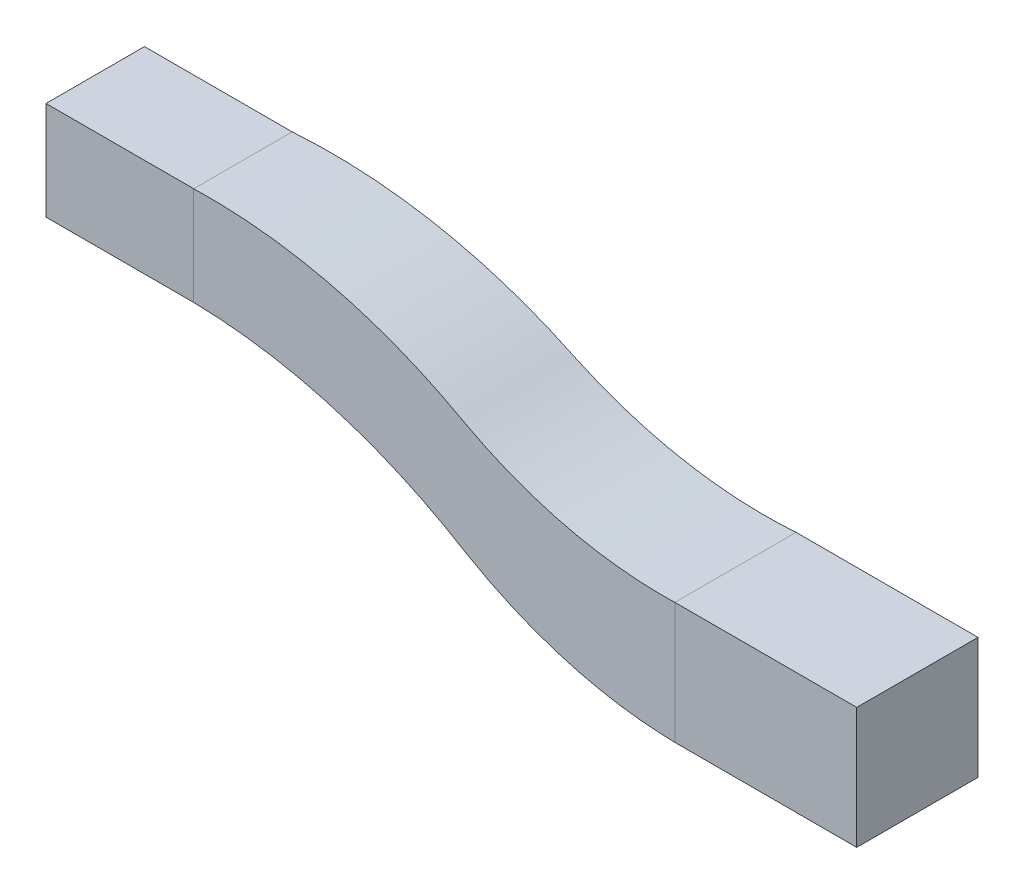
ISO-10303-21;
HEADER;
FILE_DESCRIPTION(('STEP AP214'),'2;1');
FILE_NAME('part.step','',(''),(''),'','','');
FILE_SCHEMA(('AUTOMOTIVE_DESIGN { 1 0 10303 214 1 1 1 1 }'));
ENDSEC;
DATA;
#1=APPLICATION_CONTEXT('core data for automotive mechanical design processes');
#2=APPLICATION_PROTOCOL_DEFINITION('international standard','automotive_design',2000,#1);
#3=PRODUCT_CONTEXT('',#1,'mechanical');
#4=PRODUCT('Part','Part','',(#3));
#5=PRODUCT_RELATED_PRODUCT_CATEGORY('part','',(#4));
#6=PRODUCT_DEFINITION_FORMATION('','',#4);
#7=PRODUCT_DEFINITION_CONTEXT('part definition',#1,'design');
#8=PRODUCT_DEFINITION('design','',#6,#7);
#9=PRODUCT_DEFINITION_SHAPE('','',#8);
#10=(LENGTH_UNIT() NAMED_UNIT(*) SI_UNIT(.MILLI.,.METRE.));
#11=(NAMED_UNIT(*) PLANE_ANGLE_UNIT() SI_UNIT($,.RADIAN.));
#12=(NAMED_UNIT(*) SI_UNIT($,.STERADIAN.) SOLID_ANGLE_UNIT());
#13=UNCERTAINTY_MEASURE_WITH_UNIT(LENGTH_MEASURE(1.E-05),#10,'distance_accuracy_value','');
#14=(GEOMETRIC_REPRESENTATION_CONTEXT(3) GLOBAL_UNCERTAINTY_ASSIGNED_CONTEXT((#13)) GLOBAL_UNIT_ASSIGNED_CONTEXT((#10,
#11,#12)) REPRESENTATION_CONTEXT('',''));
#15=CARTESIAN_POINT('',(0.,0.,0.));
#16=DIRECTION('',(0.,0.,1.));
#17=DIRECTION('',(1.,0.,0.));
#18=AXIS2_PLACEMENT_3D('',#15,#16,#17);
#19=CARTESIAN_POINT('',(0.,102.108,-102.108));
#20=CARTESIAN_POINT('',(196.914895518404,111.826893239597,-106.48938014345));
#21=CARTESIAN_POINT('',(392.936444227266,69.5371543284615,-110.870760286901));
#22=CARTESIAN_POINT('',(708.143629326014,-92.2794355974837,-118.744760286901));
#23=CARTESIAN_POINT('',(864.402326566791,-125.99072679191,-122.23738014345));
#24=CARTESIAN_POINT('',(1021.37315576226,-118.243305111773,-125.73));
#25=CARTESIAN_POINT('',(0.,102.108,-93.599));
#26=CARTESIAN_POINT('',(196.914895518404,111.826893239597,-97.6152651314962));
#27=CARTESIAN_POINT('',(392.936444227266,69.5371543284615,-101.631530262992));
#28=CARTESIAN_POINT('',(708.143629326014,-92.2794355974837,-108.849363596326));
#29=CARTESIAN_POINT('',(864.402326566791,-125.99072679191,-112.050931798163));
#30=CARTESIAN_POINT('',(1021.37315576226,-118.243305111773,-115.2525));
#31=CARTESIAN_POINT('',(0.,102.108,-76.581));
#32=CARTESIAN_POINT('',(196.914895518404,111.826893239597,-79.8670351075878));
#33=CARTESIAN_POINT('',(392.936444227267,69.5371543284615,-83.1530702151756));
#34=CARTESIAN_POINT('',(708.143629326014,-92.2794355974837,-89.0585702151756));
#35=CARTESIAN_POINT('',(864.402326566792,-125.99072679191,-91.6780351075878));
#36=CARTESIAN_POINT('',(1021.37315576226,-118.243305111773,-94.2975));
#37=CARTESIAN_POINT('',(0.,102.108,-51.054));
#38=CARTESIAN_POINT('',(196.914895518404,111.826893239597,-53.2446900717252));
#39=CARTESIAN_POINT('',(392.936444227266,69.5371543284615,-55.4353801434504));
#40=CARTESIAN_POINT('',(708.143629326014,-92.2794355974837,-59.3723801434504));
#41=CARTESIAN_POINT('',(864.402326566791,-125.99072679191,-61.1186900717252));
#42=CARTESIAN_POINT('',(1021.37315576226,-118.243305111773,-62.865));
#43=CARTESIAN_POINT('',(0.,102.108,-25.527));
#44=CARTESIAN_POINT('',(196.914895518404,111.826893239597,-26.6223450358626));
#45=CARTESIAN_POINT('',(392.936444227266,69.5371543284615,-27.7176900717252));
#46=CARTESIAN_POINT('',(708.143629326014,-92.2794355974838,-29.6861900717253));
#47=CARTESIAN_POINT('',(864.402326566791,-125.99072679191,-30.5593450358627));
#48=CARTESIAN_POINT('',(1021.37315576226,-118.243305111773,-31.4325000000001));
#49=CARTESIAN_POINT('',(0.,102.108,-8.509));
#50=CARTESIAN_POINT('',(196.914895518404,111.826893239597,-8.8741150119542));
#51=CARTESIAN_POINT('',(392.936444227266,69.5371543284615,-9.2392300239084));
#52=CARTESIAN_POINT('',(708.143629326014,-92.2794355974838,-9.89539669057507));
#53=CARTESIAN_POINT('',(864.402326566791,-125.99072679191,-10.1864483452875));
#54=CARTESIAN_POINT('',(1021.37315576226,-118.243305111773,-10.4775));
#55=CARTESIAN_POINT('',(0.,102.108,8.509));
#56=CARTESIAN_POINT('',(196.914895518404,111.826893239597,8.8741150119542));
#57=CARTESIAN_POINT('',(392.936444227266,69.5371543284615,9.2392300239084));
#58=CARTESIAN_POINT('',(708.143629326014,-92.2794355974838,9.89539669057507));
#59=CARTESIAN_POINT('',(864.402326566791,-125.99072679191,10.1864483452875));
#60=CARTESIAN_POINT('',(1021.37315576226,-118.243305111773,10.4775));
#61=CARTESIAN_POINT('',(0.,102.108,25.527));
#62=CARTESIAN_POINT('',(196.914895518404,111.826893239597,26.6223450358626));
#63=CARTESIAN_POINT('',(392.936444227266,69.5371543284614,27.7176900717252));
#64=CARTESIAN_POINT('',(708.143629326013,-92.2794355974838,29.6861900717252));
#65=CARTESIAN_POINT('',(864.40232656679,-125.99072679191,30.5593450358626));
#66=CARTESIAN_POINT('',(1021.37315576226,-118.243305111773,31.4325));
#67=CARTESIAN_POINT('',(0.,102.108,51.054));
#68=CARTESIAN_POINT('',(196.914895518404,111.826893239597,53.2446900717252));
#69=CARTESIAN_POINT('',(392.936444227267,69.5371543284615,55.4353801434504));
#70=CARTESIAN_POINT('',(708.143629326015,-92.2794355974837,59.3723801434504));
#71=CARTESIAN_POINT('',(864.402326566792,-125.99072679191,61.1186900717252));
#72=CARTESIAN_POINT('',(1021.37315576226,-118.243305111773,62.865));
#73=CARTESIAN_POINT('',(0.,102.108,76.5809999999999));
#74=CARTESIAN_POINT('',(196.914895518404,111.826893239597,79.8670351075878));
#75=CARTESIAN_POINT('',(392.936444227266,69.5371543284614,83.1530702151756));
#76=CARTESIAN_POINT('',(708.143629326013,-92.2794355974838,89.0585702151756));
#77=CARTESIAN_POINT('',(864.40232656679,-125.99072679191,91.6780351075878));
#78=CARTESIAN_POINT('',(1021.37315576226,-118.243305111773,94.2975));
#79=CARTESIAN_POINT('',(0.,102.108,93.5989999999999));
#80=CARTESIAN_POINT('',(196.914895518404,111.826893239597,97.6152651314962));
#81=CARTESIAN_POINT('',(392.936444227266,69.5371543284614,101.631530262992));
#82=CARTESIAN_POINT('',(708.143629326014,-92.2794355974838,108.849363596326));
#83=CARTESIAN_POINT('',(864.402326566791,-125.99072679191,112.050931798163));
#84=CARTESIAN_POINT('',(1021.37315576226,-118.243305111773,115.2525));
#85=CARTESIAN_POINT('',(0.,102.108,102.108));
#86=CARTESIAN_POINT('',(196.914895518404,111.826893239597,106.48938014345));
#87=CARTESIAN_POINT('',(392.936444227266,69.5371543284614,110.870760286901));
#88=CARTESIAN_POINT('',(708.143629326014,-92.2794355974838,118.744760286901));
#89=CARTESIAN_POINT('',(864.402326566791,-125.99072679191,122.23738014345));
#90=CARTESIAN_POINT('',(1021.37315576226,-118.243305111773,125.73));
#91=B_SPLINE_SURFACE_WITH_KNOTS('',3,3,((#19,#20,#21,#22,#23,#24),(#25,#26,#27,#28,#29,#30),
(#31,#32,#33,#34,#35,#36),(#37,#38,#39,#40,#41,#42),(#43,#44,#45,#46,#47,#48),(#49,#50,#51,#52,
#53,#54),(#55,#56,#57,#58,#59,#60),(#61,#62,#63,#64,#65,#66),(#67,#68,#69,#70,#71,#72),(#73,#74,
#75,#76,#77,#78),(#79,#80,#81,#82,#83,#84),(#85,#86,#87,#88,#89,#90)),.UNSPECIFIED.,.F.,.F.,.F.,
(4,1,1,1,2,1,1,1,4),(4,2,4),(0.75,0.78125,0.8125,0.84375,0.875,0.90625,0.9375,0.96875,1.),(0.,
0.556436391090984,1.),.UNSPECIFIED.);
#92=DIRECTION('',(0.,0.,1.));
#93=VECTOR('',#92,1.);
#94=CARTESIAN_POINT('',(0.,102.108,-102.108));
#95=LINE('',#94,#93);
#96=CARTESIAN_POINT('',(0.,102.108,-102.108));
#97=VERTEX_POINT('',#96);
#98=CARTESIAN_POINT('',(0.,102.108,102.108));
#99=VERTEX_POINT('',#98);
#100=EDGE_CURVE('E329',#97,#99,#95,.T.);
#101=CARTESIAN_POINT('',(0.,102.108,102.108));
#102=CARTESIAN_POINT('',(196.914895518404,111.826893239597,106.48938014345));
#103=CARTESIAN_POINT('',(392.936444227266,69.5371543284614,110.870760286901));
#104=CARTESIAN_POINT('',(708.143629326014,-92.2794355974838,118.744760286901));
#105=CARTESIAN_POINT('',(864.402326566791,-125.99072679191,122.23738014345));
#106=CARTESIAN_POINT('',(1021.37315576226,-118.243305111773,125.73));
#107=B_SPLINE_CURVE_WITH_KNOTS('',3,(#101,#102,#103,#104,#105,#106),.UNSPECIFIED.,.F.,.F.,(4,2,
4),(0.,0.556436391090984,1.),.UNSPECIFIED.);
#108=CARTESIAN_POINT('',(1021.37315576226,-118.243305111773,125.73));
#109=VERTEX_POINT('',#108);
#110=EDGE_CURVE('E332',#99,#109,#107,.T.);
#111=DIRECTION('',(0.,0.,1.));
#112=VECTOR('',#111,1.);
#113=CARTESIAN_POINT('',(1021.37315576226,-118.243305111773,-125.73));
#114=LINE('',#113,#112);
#115=CARTESIAN_POINT('',(1021.37315576226,-118.243305111773,-125.73));
#116=VERTEX_POINT('',#115);
#117=EDGE_CURVE('E13',#116,#109,#114,.T.);
#118=CARTESIAN_POINT('',(0.,102.108,-102.108));
#119=CARTESIAN_POINT('',(196.914895518404,111.826893239597,-106.48938014345));
#120=CARTESIAN_POINT('',(392.936444227266,69.5371543284615,-110.870760286901));
#121=CARTESIAN_POINT('',(708.143629326014,-92.2794355974837,-118.744760286901));
#122=CARTESIAN_POINT('',(864.402326566791,-125.99072679191,-122.23738014345));
#123=CARTESIAN_POINT('',(1021.37315576226,-118.243305111773,-125.73));
#124=B_SPLINE_CURVE_WITH_KNOTS('',3,(#118,#119,#120,#121,#122,#123),.UNSPECIFIED.,.F.,.F.,(4,2,
4),(0.,0.556436391090984,1.),.UNSPECIFIED.);
#125=EDGE_CURVE('E135',#97,#116,#124,.T.);
#126=ORIENTED_EDGE('',*,*,#100,.T.);
#127=ORIENTED_EDGE('',*,*,#110,.T.);
#128=ORIENTED_EDGE('',*,*,#117,.F.);
#129=ORIENTED_EDGE('',*,*,#125,.F.);
#130=EDGE_LOOP('',(#126,#127,#128,#129));
#131=FACE_BOUND('',#130,.T.);
#132=ADVANCED_FACE('F115',(#131),#91,.T.);
#133=CARTESIAN_POINT('',(0.,-102.108,-102.108));
#134=CARTESIAN_POINT('',(196.914895518404,-101.151867047304,-106.48938014345));
#135=CARTESIAN_POINT('',(392.936444227266,-152.20436624534,-110.870760286901));
#136=CARTESIAN_POINT('',(708.143629326014,-329.768956171285,-118.744760286901));
#137=CARTESIAN_POINT('',(864.402326566791,-370.465487078811,-122.23738014345));
#138=CARTESIAN_POINT('',(1021.37315576226,-369.703305111773,-125.73));
#139=CARTESIAN_POINT('',(0.,-85.0899999999999,-102.108));
#140=CARTESIAN_POINT('',(196.914895518404,-83.4036370233955,-106.48938014345));
#141=CARTESIAN_POINT('',(392.936444227266,-133.725906197523,-110.870760286901));
#142=CARTESIAN_POINT('',(708.143629326014,-309.978162790135,-118.744760286901));
#143=CARTESIAN_POINT('',(864.402326566791,-350.092590388236,-122.23738014345));
#144=CARTESIAN_POINT('',(1021.37315576226,-348.748305111773,-125.73));
#145=CARTESIAN_POINT('',(0.,-51.054,-102.108));
#146=CARTESIAN_POINT('',(196.914895518404,-47.9071769755787,-106.48938014345));
#147=CARTESIAN_POINT('',(392.936444227267,-96.7689861018899,-110.870760286901));
#148=CARTESIAN_POINT('',(708.143629326014,-270.396576027835,-118.744760286901));
#149=CARTESIAN_POINT('',(864.402326566792,-309.346797007086,-122.237380143451));
#150=CARTESIAN_POINT('',(1021.37315576226,-306.838305111773,-125.73));
#151=CARTESIAN_POINT('',(0.,0.,-102.108));
#152=CARTESIAN_POINT('',(196.914895518404,5.33751309614664,-106.48938014345));
#153=CARTESIAN_POINT('',(392.936444227266,-41.3336059584392,-110.870760286901));
#154=CARTESIAN_POINT('',(708.143629326014,-211.024195884384,-118.744760286901));
#155=CARTESIAN_POINT('',(864.402326566791,-248.22810693536,-122.23738014345));
#156=CARTESIAN_POINT('',(1021.37315576226,-243.973305111772,-125.73));
#157=CARTESIAN_POINT('',(0.,51.0540000000001,-102.108));
#158=CARTESIAN_POINT('',(196.914895518404,58.5822031678718,-106.48938014345));
#159=CARTESIAN_POINT('',(392.936444227266,14.101774185011,-110.870760286901));
#160=CARTESIAN_POINT('',(708.143629326013,-151.651815740934,-118.744760286901));
#161=CARTESIAN_POINT('',(864.402326566791,-187.109416863635,-122.237380143451));
#162=CARTESIAN_POINT('',(1021.37315576226,-181.108305111773,-125.73));
#163=CARTESIAN_POINT('',(0.,85.0900000000001,-102.108));
#164=CARTESIAN_POINT('',(196.914895518404,94.0786632156886,-106.48938014345));
#165=CARTESIAN_POINT('',(392.936444227266,51.0586942806447,-110.870760286901));
#166=CARTESIAN_POINT('',(708.143629326014,-112.070228978634,-118.744760286901));
#167=CARTESIAN_POINT('',(864.402326566791,-146.363623482485,-122.23738014345));
#168=CARTESIAN_POINT('',(1021.37315576226,-139.198305111773,-125.73));
#169=CARTESIAN_POINT('',(0.,102.108,-102.108));
#170=CARTESIAN_POINT('',(196.914895518404,111.826893239597,-106.48938014345));
#171=CARTESIAN_POINT('',(392.936444227266,69.5371543284615,-110.870760286901));
#172=CARTESIAN_POINT('',(708.143629326014,-92.2794355974837,-118.744760286901));
#173=CARTESIAN_POINT('',(864.402326566791,-125.99072679191,-122.23738014345));
#174=CARTESIAN_POINT('',(1021.37315576226,-118.243305111773,-125.73));
#175=B_SPLINE_SURFACE_WITH_KNOTS('',3,3,((#133,#134,#135,#136,#137,#138),(#139,#140,#141,#142,
#143,#144),(#145,#146,#147,#148,#149,#150),(#151,#152,#153,#154,#155,#156),(#157,#158,#159,#160,
#161,#162),(#163,#164,#165,#166,#167,#168),(#169,#170,#171,#172,#173,#174)),.UNSPECIFIED.,.F.,
.F.,.F.,(4,1,1,1,4),(4,2,4),(0.5,0.5625,0.625,0.6875,0.75),(0.,0.556436391090984,1.),.UNSPECIFIED.);
#176=DIRECTION('',(0.,1.,0.));
#177=VECTOR('',#176,1.);
#178=CARTESIAN_POINT('',(0.,102.108,-102.108));
#179=LINE('',#178,#177);
#180=CARTESIAN_POINT('',(0.,-102.108,-102.108));
#181=VERTEX_POINT('',#180);
#182=EDGE_CURVE('E274',#181,#97,#179,.T.);
#183=DIRECTION('',(0.,1.,0.));
#184=VECTOR('',#183,1.);
#185=CARTESIAN_POINT('',(1021.37315576226,-118.243305111773,-125.73));
#186=LINE('',#185,#184);
#187=CARTESIAN_POINT('',(1021.37315576226,-369.703305111773,-125.73));
#188=VERTEX_POINT('',#187);
#189=EDGE_CURVE('E127',#188,#116,#186,.T.);
#190=CARTESIAN_POINT('',(0.,-102.108,-102.108));
#191=CARTESIAN_POINT('',(196.914895518404,-101.151867047304,-106.48938014345));
#192=CARTESIAN_POINT('',(392.936444227266,-152.20436624534,-110.870760286901));
#193=CARTESIAN_POINT('',(708.143629326014,-329.768956171285,-118.744760286901));
#194=CARTESIAN_POINT('',(864.402326566791,-370.465487078811,-122.23738014345));
#195=CARTESIAN_POINT('',(1021.37315576226,-369.703305111773,-125.73));
#196=B_SPLINE_CURVE_WITH_KNOTS('',3,(#190,#191,#192,#193,#194,#195),.UNSPECIFIED.,.F.,.F.,(4,2,
4),(0.,0.556436391090984,1.),.UNSPECIFIED.);
#197=EDGE_CURVE('E350',#181,#188,#196,.T.);
#198=ORIENTED_EDGE('',*,*,#182,.T.);
#199=ORIENTED_EDGE('',*,*,#125,.T.);
#200=ORIENTED_EDGE('',*,*,#189,.F.);
#201=ORIENTED_EDGE('',*,*,#197,.F.);
#202=EDGE_LOOP('',(#198,#199,#200,#201));
#203=FACE_BOUND('',#202,.T.);
#204=ADVANCED_FACE('F320',(#203),#175,.T.);
#205=CARTESIAN_POINT('',(0.,-102.108,102.108));
#206=CARTESIAN_POINT('',(196.914895518404,-101.151867047304,106.48938014345));
#207=CARTESIAN_POINT('',(392.936444227266,-152.20436624534,110.870760286901));
#208=CARTESIAN_POINT('',(708.143629326014,-329.768956171285,118.744760286901));
#209=CARTESIAN_POINT('',(864.402326566791,-370.465487078811,122.23738014345));
#210=CARTESIAN_POINT('',(1021.37315576226,-369.703305111773,125.73));
#211=CARTESIAN_POINT('',(0.,-102.108,85.0899999999998));
#212=CARTESIAN_POINT('',(196.914895518404,-101.151867047304,88.7411501195419));
#213=CARTESIAN_POINT('',(392.936444227266,-152.20436624534,92.3923002390839));
#214=CARTESIAN_POINT('',(708.143629326014,-329.768956171285,98.9539669057506));
#215=CARTESIAN_POINT('',(864.402326566791,-370.465487078811,101.864483452875));
#216=CARTESIAN_POINT('',(1021.37315576226,-369.703305111773,104.775));
#217=CARTESIAN_POINT('',(0.,-102.108,51.0539999999999));
#218=CARTESIAN_POINT('',(196.914895518404,-101.151867047304,53.2446900717251));
#219=CARTESIAN_POINT('',(392.936444227267,-152.20436624534,55.4353801434503));
#220=CARTESIAN_POINT('',(708.143629326014,-329.768956171286,59.3723801434504));
#221=CARTESIAN_POINT('',(864.402326566792,-370.465487078811,61.1186900717252));
#222=CARTESIAN_POINT('',(1021.37315576226,-369.703305111773,62.865));
#223=CARTESIAN_POINT('',(0.,-102.108,0.));
#224=CARTESIAN_POINT('',(196.914895518404,-101.151867047304,0.));
#225=CARTESIAN_POINT('',(392.936444227266,-152.20436624534,0.));
#226=CARTESIAN_POINT('',(708.143629326014,-329.768956171285,0.));
#227=CARTESIAN_POINT('',(864.402326566791,-370.46548707881,0.));
#228=CARTESIAN_POINT('',(1021.37315576226,-369.703305111772,0.));
#229=CARTESIAN_POINT('',(0.,-102.108,-51.0540000000001));
#230=CARTESIAN_POINT('',(196.914895518404,-101.151867047304,-53.2446900717253));
#231=CARTESIAN_POINT('',(392.936444227266,-152.20436624534,-55.4353801434505));
#232=CARTESIAN_POINT('',(708.143629326013,-329.768956171286,-59.3723801434505));
#233=CARTESIAN_POINT('',(864.402326566791,-370.465487078811,-61.1186900717253));
#234=CARTESIAN_POINT('',(1021.37315576226,-369.703305111773,-62.8650000000001));
#235=CARTESIAN_POINT('',(0.,-102.108,-85.09));
#236=CARTESIAN_POINT('',(196.914895518404,-101.151867047304,-88.7411501195421));
#237=CARTESIAN_POINT('',(392.936444227266,-152.20436624534,-92.3923002390841));
#238=CARTESIAN_POINT('',(708.143629326014,-329.768956171285,-98.9539669057508));
#239=CARTESIAN_POINT('',(864.402326566791,-370.465487078811,-101.864483452875));
#240=CARTESIAN_POINT('',(1021.37315576226,-369.703305111773,-104.775));
#241=CARTESIAN_POINT('',(0.,-102.108,-102.108));
#242=CARTESIAN_POINT('',(196.914895518404,-101.151867047304,-106.48938014345));
#243=CARTESIAN_POINT('',(392.936444227266,-152.20436624534,-110.870760286901));
#244=CARTESIAN_POINT('',(708.143629326014,-329.768956171285,-118.744760286901));
#245=CARTESIAN_POINT('',(864.402326566791,-370.465487078811,-122.23738014345));
#246=CARTESIAN_POINT('',(1021.37315576226,-369.703305111773,-125.73));
#247=B_SPLINE_SURFACE_WITH_KNOTS('',3,3,((#205,#206,#207,#208,#209,#210),(#211,#212,#213,#214,
#215,#216),(#217,#218,#219,#220,#221,#222),(#223,#224,#225,#226,#227,#228),(#229,#230,#231,#232,
#233,#234),(#235,#236,#237,#238,#239,#240),(#241,#242,#243,#244,#245,#246)),.UNSPECIFIED.,.F.,
.F.,.F.,(4,1,1,1,4),(4,2,4),(0.25,0.3125,0.375,0.4375,0.5),(0.,0.556436391090984,1.),.UNSPECIFIED.);
#248=DIRECTION('',(0.,0.,-1.));
#249=VECTOR('',#248,1.);
#250=CARTESIAN_POINT('',(0.,-102.108,-102.108));
#251=LINE('',#250,#249);
#252=CARTESIAN_POINT('',(0.,-102.108,102.108));
#253=VERTEX_POINT('',#252);
#254=EDGE_CURVE('E270',#253,#181,#251,.T.);
#255=DIRECTION('',(0.,0.,-1.));
#256=VECTOR('',#255,1.);
#257=CARTESIAN_POINT('',(1021.37315576226,-369.703305111773,-125.73));
#258=LINE('',#257,#256);
#259=CARTESIAN_POINT('',(1021.37315576226,-369.703305111773,125.73));
#260=VERTEX_POINT('',#259);
#261=EDGE_CURVE('E220',#260,#188,#258,.T.);
#262=CARTESIAN_POINT('',(0.,-102.108,102.108));
#263=CARTESIAN_POINT('',(196.914895518404,-101.151867047304,106.48938014345));
#264=CARTESIAN_POINT('',(392.936444227266,-152.20436624534,110.870760286901));
#265=CARTESIAN_POINT('',(708.143629326014,-329.768956171285,118.744760286901));
#266=CARTESIAN_POINT('',(864.402326566791,-370.465487078811,122.23738014345));
#267=CARTESIAN_POINT('',(1021.37315576226,-369.703305111773,125.73));
#268=B_SPLINE_CURVE_WITH_KNOTS('',3,(#262,#263,#264,#265,#266,#267),.UNSPECIFIED.,.F.,.F.,(4,2,
4),(0.,0.556436391090984,1.),.UNSPECIFIED.);
#269=EDGE_CURVE('E335',#253,#260,#268,.T.);
#270=ORIENTED_EDGE('',*,*,#254,.T.);
#271=ORIENTED_EDGE('',*,*,#197,.T.);
#272=ORIENTED_EDGE('',*,*,#261,.F.);
#273=ORIENTED_EDGE('',*,*,#269,.F.);
#274=EDGE_LOOP('',(#270,#271,#272,#273));
#275=FACE_BOUND('',#274,.T.);
#276=ADVANCED_FACE('F326',(#275),#247,.T.);
#277=CARTESIAN_POINT('',(0.,102.108,102.108));
#278=CARTESIAN_POINT('',(196.914895518404,111.826893239597,106.48938014345));
#279=CARTESIAN_POINT('',(392.936444227266,69.5371543284614,110.870760286901));
#280=CARTESIAN_POINT('',(708.143629326014,-92.2794355974838,118.744760286901));
#281=CARTESIAN_POINT('',(864.402326566791,-125.99072679191,122.23738014345));
#282=CARTESIAN_POINT('',(1021.37315576226,-118.243305111773,125.73));
#283=CARTESIAN_POINT('',(0.,85.09,102.108));
#284=CARTESIAN_POINT('',(196.914895518404,94.0786632156885,106.48938014345));
#285=CARTESIAN_POINT('',(392.936444227266,51.0586942806446,110.870760286901));
#286=CARTESIAN_POINT('',(708.143629326014,-112.070228978634,118.744760286901));
#287=CARTESIAN_POINT('',(864.402326566791,-146.363623482485,122.23738014345));
#288=CARTESIAN_POINT('',(1021.37315576226,-139.198305111773,125.73));
#289=CARTESIAN_POINT('',(0.,51.054,102.108));
#290=CARTESIAN_POINT('',(196.914895518404,58.5822031678717,106.48938014345));
#291=CARTESIAN_POINT('',(392.936444227267,14.101774185011,110.870760286901));
#292=CARTESIAN_POINT('',(708.143629326014,-151.651815740934,118.744760286901));
#293=CARTESIAN_POINT('',(864.402326566792,-187.109416863635,122.237380143451));
#294=CARTESIAN_POINT('',(1021.37315576226,-181.108305111773,125.73));
#295=CARTESIAN_POINT('',(0.,0.,102.108));
#296=CARTESIAN_POINT('',(196.914895518404,5.33751309614654,106.48938014345));
#297=CARTESIAN_POINT('',(392.936444227266,-41.3336059584393,110.870760286901));
#298=CARTESIAN_POINT('',(708.143629326013,-211.024195884385,118.744760286901));
#299=CARTESIAN_POINT('',(864.40232656679,-248.22810693536,122.23738014345));
#300=CARTESIAN_POINT('',(1021.37315576226,-243.973305111773,125.73));
#301=CARTESIAN_POINT('',(0.,-51.054,102.108));
#302=CARTESIAN_POINT('',(196.914895518404,-47.9071769755787,106.48938014345));
#303=CARTESIAN_POINT('',(392.936444227266,-96.7689861018898,110.870760286901));
#304=CARTESIAN_POINT('',(708.143629326014,-270.396576027835,118.744760286901));
#305=CARTESIAN_POINT('',(864.402326566791,-309.346797007085,122.237380143451));
#306=CARTESIAN_POINT('',(1021.37315576226,-306.838305111773,125.73));
#307=CARTESIAN_POINT('',(0.,-85.09,102.108));
#308=CARTESIAN_POINT('',(196.914895518404,-83.4036370233955,106.48938014345));
#309=CARTESIAN_POINT('',(392.936444227266,-133.725906197523,110.870760286901));
#310=CARTESIAN_POINT('',(708.143629326014,-309.978162790135,118.744760286901));
#311=CARTESIAN_POINT('',(864.402326566791,-350.092590388236,122.23738014345));
#312=CARTESIAN_POINT('',(1021.37315576226,-348.748305111773,125.73));
#313=CARTESIAN_POINT('',(0.,-102.108,102.108));
#314=CARTESIAN_POINT('',(196.914895518404,-101.151867047304,106.48938014345));
#315=CARTESIAN_POINT('',(392.936444227266,-152.20436624534,110.870760286901));
#316=CARTESIAN_POINT('',(708.143629326014,-329.768956171285,118.744760286901));
#317=CARTESIAN_POINT('',(864.402326566791,-370.465487078811,122.23738014345));
#318=CARTESIAN_POINT('',(1021.37315576226,-369.703305111773,125.73));
#319=B_SPLINE_SURFACE_WITH_KNOTS('',3,3,((#277,#278,#279,#280,#281,#282),(#283,#284,#285,#286,
#287,#288),(#289,#290,#291,#292,#293,#294),(#295,#296,#297,#298,#299,#300),(#301,#302,#303,#304,
#305,#306),(#307,#308,#309,#310,#311,#312),(#313,#314,#315,#316,#317,#318)),.UNSPECIFIED.,.F.,
.F.,.F.,(4,1,1,1,4),(4,2,4),(0.,0.0625,0.125,0.1875,0.25),(0.,0.556436391090984,1.),.UNSPECIFIED.);
#320=DIRECTION('',(0.,-1.,0.));
#321=VECTOR('',#320,1.);
#322=CARTESIAN_POINT('',(0.,102.108,102.108));
#323=LINE('',#322,#321);
#324=EDGE_CURVE('E275',#99,#253,#323,.T.);
#325=DIRECTION('',(0.,-1.,0.));
#326=VECTOR('',#325,1.);
#327=CARTESIAN_POINT('',(1021.37315576226,-118.243305111773,125.73));
#328=LINE('',#327,#326);
#329=EDGE_CURVE('E121',#109,#260,#328,.T.);
#330=ORIENTED_EDGE('',*,*,#324,.T.);
#331=ORIENTED_EDGE('',*,*,#269,.T.);
#332=ORIENTED_EDGE('',*,*,#329,.F.);
#333=ORIENTED_EDGE('',*,*,#110,.F.);
#334=EDGE_LOOP('',(#330,#331,#332,#333));
#335=FACE_BOUND('',#334,.T.);
#336=ADVANCED_FACE('F376',(#335),#319,.T.);
#337=CARTESIAN_POINT('',(-306.324,102.108,-102.108));
#338=DIRECTION('',(0.,0.,-1.));
#339=DIRECTION('',(-1.,0.,0.));
#340=AXIS2_PLACEMENT_3D('',#337,#338,#339);
#341=PLANE('',#340);
#342=ORIENTED_EDGE('',*,*,#182,.F.);
#343=DIRECTION('',(1.,0.,0.));
#344=VECTOR('',#343,1.);
#345=CARTESIAN_POINT('',(-306.324,-102.108,-102.108));
#346=LINE('',#345,#344);
#347=CARTESIAN_POINT('',(-306.324,-102.108,-102.108));
#348=VERTEX_POINT('',#347);
#349=EDGE_CURVE('E266',#348,#181,#346,.T.);
#350=ORIENTED_EDGE('',*,*,#349,.F.);
#351=DIRECTION('',(0.,1.,0.));
#352=VECTOR('',#351,1.);
#353=CARTESIAN_POINT('',(-306.324,102.108,-102.108));
#354=LINE('',#353,#352);
#355=CARTESIAN_POINT('',(-306.324,102.108,-102.108));
#356=VERTEX_POINT('',#355);
#357=EDGE_CURVE('E211',#348,#356,#354,.T.);
#358=ORIENTED_EDGE('',*,*,#357,.T.);
#359=DIRECTION('',(1.,0.,0.));
#360=VECTOR('',#359,1.);
#361=CARTESIAN_POINT('',(-306.324,102.108,-102.108));
#362=LINE('',#361,#360);
#363=EDGE_CURVE('E474',#356,#97,#362,.T.);
#364=ORIENTED_EDGE('',*,*,#363,.T.);
#365=EDGE_LOOP('',(#342,#350,#358,#364));
#366=FACE_BOUND('',#365,.T.);
#367=ADVANCED_FACE('F248',(#366),#341,.T.);
#368=CARTESIAN_POINT('',(-306.324,-102.108,102.108));
#369=DIRECTION('',(0.,-1.,0.));
#370=DIRECTION('',(0.,0.,-1.));
#371=AXIS2_PLACEMENT_3D('',#368,#369,#370);
#372=PLANE('',#371);
#373=ORIENTED_EDGE('',*,*,#254,.F.);
#374=DIRECTION('',(1.,0.,0.));
#375=VECTOR('',#374,1.);
#376=CARTESIAN_POINT('',(-306.324,-102.108,102.108));
#377=LINE('',#376,#375);
#378=CARTESIAN_POINT('',(-306.324,-102.108,102.108));
#379=VERTEX_POINT('',#378);
#380=EDGE_CURVE('E259',#379,#253,#377,.T.);
#381=ORIENTED_EDGE('',*,*,#380,.F.);
#382=DIRECTION('',(0.,0.,-1.));
#383=VECTOR('',#382,1.);
#384=CARTESIAN_POINT('',(-306.324,-102.108,102.108));
#385=LINE('',#384,#383);
#386=EDGE_CURVE('E339',#379,#348,#385,.T.);
#387=ORIENTED_EDGE('',*,*,#386,.T.);
#388=ORIENTED_EDGE('',*,*,#349,.T.);
#389=EDGE_LOOP('',(#373,#381,#387,#388));
#390=FACE_BOUND('',#389,.T.);
#391=ADVANCED_FACE('F243',(#390),#372,.T.);
#392=CARTESIAN_POINT('',(-306.324,102.108,102.108));
#393=DIRECTION('',(0.,0.,1.));
#394=DIRECTION('',(1.,0.,0.));
#395=AXIS2_PLACEMENT_3D('',#392,#393,#394);
#396=PLANE('',#395);
#397=ORIENTED_EDGE('',*,*,#324,.F.);
#398=DIRECTION('',(1.,0.,0.));
#399=VECTOR('',#398,1.);
#400=CARTESIAN_POINT('',(-306.324,102.108,102.108));
#401=LINE('',#400,#399);
#402=CARTESIAN_POINT('',(-306.324,102.108,102.108));
#403=VERTEX_POINT('',#402);
#404=EDGE_CURVE('E267',#403,#99,#401,.T.);
#405=ORIENTED_EDGE('',*,*,#404,.F.);
#406=DIRECTION('',(0.,-1.,0.));
#407=VECTOR('',#406,1.);
#408=CARTESIAN_POINT('',(-306.324,102.108,102.108));
#409=LINE('',#408,#407);
#410=EDGE_CURVE('E499',#403,#379,#409,.T.);
#411=ORIENTED_EDGE('',*,*,#410,.T.);
#412=ORIENTED_EDGE('',*,*,#380,.T.);
#413=EDGE_LOOP('',(#397,#405,#411,#412));
#414=FACE_BOUND('',#413,.T.);
#415=ADVANCED_FACE('F247',(#414),#396,.T.);
#416=CARTESIAN_POINT('',(-306.324,102.108,102.108));
#417=DIRECTION('',(0.,1.,0.));
#418=DIRECTION('',(0.,0.,1.));
#419=AXIS2_PLACEMENT_3D('',#416,#417,#418);
#420=PLANE('',#419);
#421=ORIENTED_EDGE('',*,*,#100,.F.);
#422=ORIENTED_EDGE('',*,*,#363,.F.);
#423=DIRECTION('',(0.,0.,1.));
#424=VECTOR('',#423,1.);
#425=CARTESIAN_POINT('',(-306.324,102.108,102.108));
#426=LINE('',#425,#424);
#427=EDGE_CURVE('E214',#356,#403,#426,.T.);
#428=ORIENTED_EDGE('',*,*,#427,.T.);
#429=ORIENTED_EDGE('',*,*,#404,.T.);
#430=EDGE_LOOP('',(#421,#422,#428,#429));
#431=FACE_BOUND('',#430,.T.);
#432=ADVANCED_FACE('F241',(#431),#420,.T.);
#433=CARTESIAN_POINT('',(-306.324,0.,0.));
#434=DIRECTION('',(1.,0.,0.));
#435=DIRECTION('',(0.,0.,-1.));
#436=AXIS2_PLACEMENT_3D('',#433,#434,#435);
#437=PLANE('',#436);
#438=ORIENTED_EDGE('',*,*,#357,.F.);
#439=ORIENTED_EDGE('',*,*,#386,.F.);
#440=ORIENTED_EDGE('',*,*,#410,.F.);
#441=ORIENTED_EDGE('',*,*,#427,.F.);
#442=EDGE_LOOP('',(#438,#439,#440,#441));
#443=FACE_BOUND('',#442,.T.);
#444=ADVANCED_FACE('F236',(#443),#437,.F.);
#445=CARTESIAN_POINT('',(1398.56315576226,-118.243305111773,125.73));
#446=DIRECTION('',(0.,0.,-1.));
#447=DIRECTION('',(-1.,0.,0.));
#448=AXIS2_PLACEMENT_3D('',#445,#446,#447);
#449=PLANE('',#448);
#450=ORIENTED_EDGE('',*,*,#329,.T.);
#451=DIRECTION('',(-1.,0.,0.));
#452=VECTOR('',#451,1.);
#453=CARTESIAN_POINT('',(1398.56315576226,-369.703305111773,125.73));
#454=LINE('',#453,#452);
#455=CARTESIAN_POINT('',(1398.56315576226,-369.703305111773,125.73));
#456=VERTEX_POINT('',#455);
#457=EDGE_CURVE('E191',#456,#260,#454,.T.);
#458=ORIENTED_EDGE('',*,*,#457,.F.);
#459=DIRECTION('',(0.,-1.,0.));
#460=VECTOR('',#459,1.);
#461=CARTESIAN_POINT('',(1398.56315576226,-118.243305111773,125.73));
#462=LINE('',#461,#460);
#463=CARTESIAN_POINT('',(1398.56315576226,-118.243305111773,125.73));
#464=VERTEX_POINT('',#463);
#465=EDGE_CURVE('E198',#464,#456,#462,.T.);
#466=ORIENTED_EDGE('',*,*,#465,.F.);
#467=DIRECTION('',(-1.,0.,0.));
#468=VECTOR('',#467,1.);
#469=CARTESIAN_POINT('',(1398.56315576226,-118.243305111773,125.73));
#470=LINE('',#469,#468);
#471=EDGE_CURVE('E294',#464,#109,#470,.T.);
#472=ORIENTED_EDGE('',*,*,#471,.T.);
#473=EDGE_LOOP('',(#450,#458,#466,#472));
#474=FACE_BOUND('',#473,.T.);
#475=ADVANCED_FACE('F208',(#474),#449,.F.);
#476=CARTESIAN_POINT('',(1398.56315576226,-369.703305111773,125.73));
#477=DIRECTION('',(0.,1.,0.));
#478=DIRECTION('',(0.,0.,1.));
#479=AXIS2_PLACEMENT_3D('',#476,#477,#478);
#480=PLANE('',#479);
#481=ORIENTED_EDGE('',*,*,#261,.T.);
#482=DIRECTION('',(-1.,0.,0.));
#483=VECTOR('',#482,1.);
#484=CARTESIAN_POINT('',(1398.56315576226,-369.703305111773,-125.73));
#485=LINE('',#484,#483);
#486=CARTESIAN_POINT('',(1398.56315576226,-369.703305111773,-125.73));
#487=VERTEX_POINT('',#486);
#488=EDGE_CURVE('E194',#487,#188,#485,.T.);
#489=ORIENTED_EDGE('',*,*,#488,.F.);
#490=DIRECTION('',(0.,0.,-1.));
#491=VECTOR('',#490,1.);
#492=CARTESIAN_POINT('',(1398.56315576226,-369.703305111773,125.73));
#493=LINE('',#492,#491);
#494=EDGE_CURVE('E186',#456,#487,#493,.T.);
#495=ORIENTED_EDGE('',*,*,#494,.F.);
#496=ORIENTED_EDGE('',*,*,#457,.T.);
#497=EDGE_LOOP('',(#481,#489,#495,#496));
#498=FACE_BOUND('',#497,.T.);
#499=ADVANCED_FACE('F189',(#498),#480,.F.);
#500=CARTESIAN_POINT('',(1398.56315576226,-118.243305111773,-125.73));
#501=DIRECTION('',(0.,0.,1.));
#502=DIRECTION('',(1.,0.,0.));
#503=AXIS2_PLACEMENT_3D('',#500,#501,#502);
#504=PLANE('',#503);
#505=ORIENTED_EDGE('',*,*,#189,.T.);
#506=DIRECTION('',(-1.,0.,0.));
#507=VECTOR('',#506,1.);
#508=CARTESIAN_POINT('',(1398.56315576226,-118.243305111773,-125.73));
#509=LINE('',#508,#507);
#510=CARTESIAN_POINT('',(1398.56315576226,-118.243305111773,-125.73));
#511=VERTEX_POINT('',#510);
#512=EDGE_CURVE('E216',#511,#116,#509,.T.);
#513=ORIENTED_EDGE('',*,*,#512,.F.);
#514=DIRECTION('',(0.,1.,0.));
#515=VECTOR('',#514,1.);
#516=CARTESIAN_POINT('',(1398.56315576226,-118.243305111773,-125.73));
#517=LINE('',#516,#515);
#518=EDGE_CURVE('E197',#487,#511,#517,.T.);
#519=ORIENTED_EDGE('',*,*,#518,.F.);
#520=ORIENTED_EDGE('',*,*,#488,.T.);
#521=EDGE_LOOP('',(#505,#513,#519,#520));
#522=FACE_BOUND('',#521,.T.);
#523=ADVANCED_FACE('F303',(#522),#504,.F.);
#524=CARTESIAN_POINT('',(1398.56315576226,-118.243305111773,125.73));
#525=DIRECTION('',(0.,-1.,0.));
#526=DIRECTION('',(0.,0.,-1.));
#527=AXIS2_PLACEMENT_3D('',#524,#525,#526);
#528=PLANE('',#527);
#529=ORIENTED_EDGE('',*,*,#117,.T.);
#530=ORIENTED_EDGE('',*,*,#471,.F.);
#531=DIRECTION('',(0.,0.,1.));
#532=VECTOR('',#531,1.);
#533=CARTESIAN_POINT('',(1398.56315576226,-118.243305111773,125.73));
#534=LINE('',#533,#532);
#535=EDGE_CURVE('E203',#511,#464,#534,.T.);
#536=ORIENTED_EDGE('',*,*,#535,.F.);
#537=ORIENTED_EDGE('',*,*,#512,.T.);
#538=EDGE_LOOP('',(#529,#530,#536,#537));
#539=FACE_BOUND('',#538,.T.);
#540=ADVANCED_FACE('F311',(#539),#528,.F.);
#541=CARTESIAN_POINT('',(1398.56315576226,0.,0.));
#542=DIRECTION('',(1.,0.,0.));
#543=DIRECTION('',(0.,0.,-1.));
#544=AXIS2_PLACEMENT_3D('',#541,#542,#543);
#545=PLANE('',#544);
#546=ORIENTED_EDGE('',*,*,#465,.T.);
#547=ORIENTED_EDGE('',*,*,#494,.T.);
#548=ORIENTED_EDGE('',*,*,#518,.T.);
#549=ORIENTED_EDGE('',*,*,#535,.T.);
#550=EDGE_LOOP('',(#546,#547,#548,#549));
#551=FACE_BOUND('',#550,.T.);
#552=ADVANCED_FACE('F201',(#551),#545,.T.);
#553=CLOSED_SHELL('',(#132,#204,#276,#336,#367,#391,#415,#432,#444,#475,#499,#523,#540,#552));
#554=MANIFOLD_SOLID_BREP('B2',#553);
#555=ADVANCED_BREP_SHAPE_REPRESENTATION('',(#18,#554),#14);
#556=SHAPE_DEFINITION_REPRESENTATION(#9,#555);
ENDSEC;
END-ISO-10303-21;
